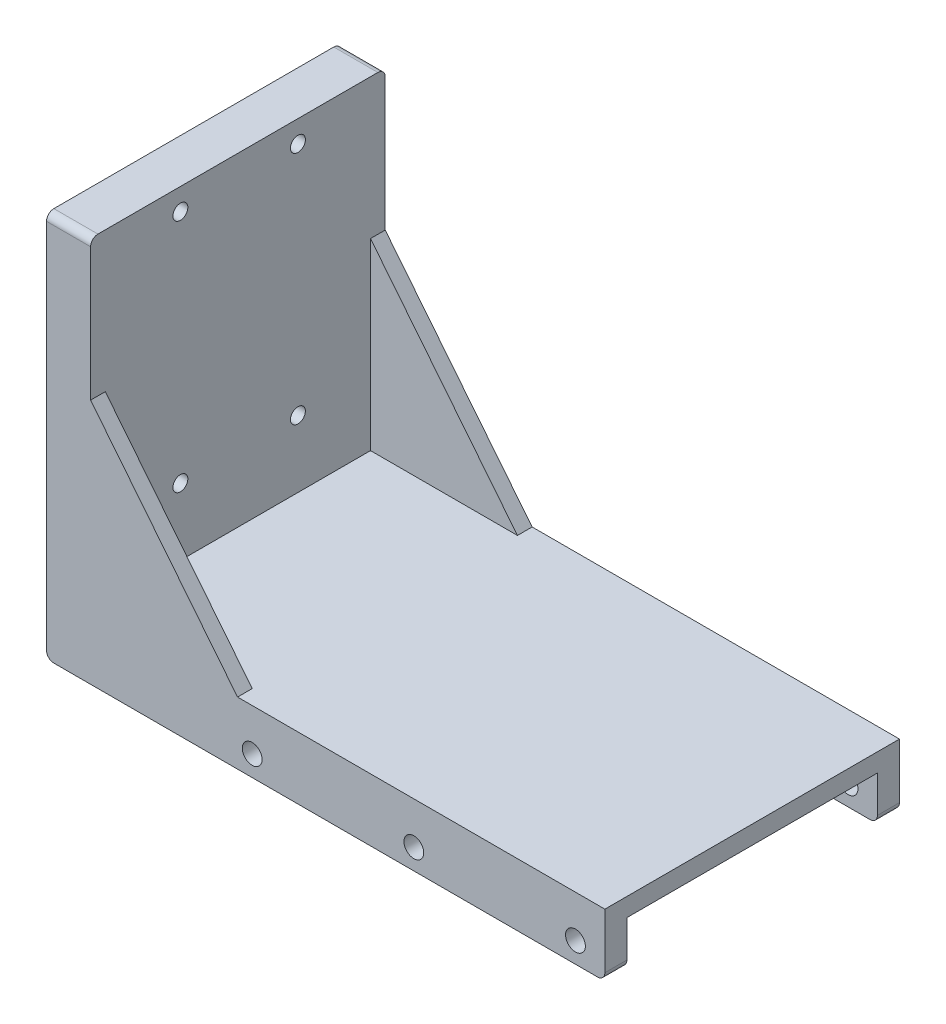
ISO-10303-21;
HEADER;
FILE_DESCRIPTION(('STEP AP214'),'2;1');
FILE_NAME('part.step','',(''),(''),'','','');
FILE_SCHEMA(('AUTOMOTIVE_DESIGN { 1 0 10303 214 1 1 1 1 }'));
ENDSEC;
DATA;
#1=APPLICATION_CONTEXT('core data for automotive mechanical design processes');
#2=APPLICATION_PROTOCOL_DEFINITION('international standard','automotive_design',2000,#1);
#3=PRODUCT_CONTEXT('',#1,'mechanical');
#4=PRODUCT('Part','Part','',(#3));
#5=PRODUCT_RELATED_PRODUCT_CATEGORY('part','',(#4));
#6=PRODUCT_DEFINITION_FORMATION('','',#4);
#7=PRODUCT_DEFINITION_CONTEXT('part definition',#1,'design');
#8=PRODUCT_DEFINITION('design','',#6,#7);
#9=PRODUCT_DEFINITION_SHAPE('','',#8);
#10=(LENGTH_UNIT() NAMED_UNIT(*) SI_UNIT(.MILLI.,.METRE.));
#11=(NAMED_UNIT(*) PLANE_ANGLE_UNIT() SI_UNIT($,.RADIAN.));
#12=(NAMED_UNIT(*) SI_UNIT($,.STERADIAN.) SOLID_ANGLE_UNIT());
#13=UNCERTAINTY_MEASURE_WITH_UNIT(LENGTH_MEASURE(1.E-05),#10,'distance_accuracy_value','');
#14=(GEOMETRIC_REPRESENTATION_CONTEXT(3) GLOBAL_UNCERTAINTY_ASSIGNED_CONTEXT((#13)) GLOBAL_UNIT_ASSIGNED_CONTEXT((#10,
#11,#12)) REPRESENTATION_CONTEXT('',''));
#15=CARTESIAN_POINT('',(0.,0.,0.));
#16=DIRECTION('',(0.,0.,1.));
#17=DIRECTION('',(1.,0.,0.));
#18=AXIS2_PLACEMENT_3D('',#15,#16,#17);
#19=CARTESIAN_POINT('',(6.00000000000001,8.5,40.1));
#20=DIRECTION('',(0.,-1.,0.));
#21=DIRECTION('',(0.,0.,-1.));
#22=AXIS2_PLACEMENT_3D('',#19,#20,#21);
#23=PLANE('',#22);
#24=DIRECTION('',(0.,0.,-1.));
#25=VECTOR('',#24,1.);
#26=CARTESIAN_POINT('',(26.,8.5,2.));
#27=LINE('',#26,#25);
#28=CARTESIAN_POINT('',(26.,8.5,2.));
#29=VERTEX_POINT('',#28);
#30=CARTESIAN_POINT('',(26.,8.5,0.));
#31=VERTEX_POINT('',#30);
#32=EDGE_CURVE('E376',#29,#31,#27,.T.);
#33=ORIENTED_EDGE('',*,*,#32,.F.);
#34=DIRECTION('',(1.,0.,0.));
#35=VECTOR('',#34,1.);
#36=CARTESIAN_POINT('',(6.00000000000001,8.5,2.));
#37=LINE('',#36,#35);
#38=CARTESIAN_POINT('',(6.00000000000001,8.5,2.));
#39=VERTEX_POINT('',#38);
#40=EDGE_CURVE('E187',#39,#29,#37,.T.);
#41=ORIENTED_EDGE('',*,*,#40,.F.);
#42=DIRECTION('',(0.,0.,-1.));
#43=VECTOR('',#42,1.);
#44=CARTESIAN_POINT('',(6.00000000000001,8.5,40.1));
#45=LINE('',#44,#43);
#46=CARTESIAN_POINT('',(6.00000000000001,8.5,38.1));
#47=VERTEX_POINT('',#46);
#48=EDGE_CURVE('E180',#47,#39,#45,.T.);
#49=ORIENTED_EDGE('',*,*,#48,.F.);
#50=DIRECTION('',(1.,0.,0.));
#51=VECTOR('',#50,1.);
#52=CARTESIAN_POINT('',(6.00000000000001,8.5,38.1));
#53=LINE('',#52,#51);
#54=CARTESIAN_POINT('',(26.,8.5,38.1));
#55=VERTEX_POINT('',#54);
#56=EDGE_CURVE('E165',#47,#55,#53,.T.);
#57=ORIENTED_EDGE('',*,*,#56,.T.);
#58=DIRECTION('',(0.,0.,1.));
#59=VECTOR('',#58,1.);
#60=CARTESIAN_POINT('',(26.,8.5,38.1));
#61=LINE('',#60,#59);
#62=CARTESIAN_POINT('',(26.,8.5,40.1));
#63=VERTEX_POINT('',#62);
#64=EDGE_CURVE('E371',#55,#63,#61,.T.);
#65=ORIENTED_EDGE('',*,*,#64,.T.);
#66=DIRECTION('',(-1.,0.,0.));
#67=VECTOR('',#66,1.);
#68=CARTESIAN_POINT('',(6.00000000000001,8.5,40.1));
#69=LINE('',#68,#67);
#70=CARTESIAN_POINT('',(76.,8.5,40.1));
#71=VERTEX_POINT('',#70);
#72=EDGE_CURVE('E301',#71,#63,#69,.T.);
#73=ORIENTED_EDGE('',*,*,#72,.F.);
#74=DIRECTION('',(0.,0.,-1.));
#75=VECTOR('',#74,1.);
#76=CARTESIAN_POINT('',(76.,8.5,40.1));
#77=LINE('',#76,#75);
#78=CARTESIAN_POINT('',(76.,8.5,0.));
#79=VERTEX_POINT('',#78);
#80=EDGE_CURVE('E188',#71,#79,#77,.T.);
#81=ORIENTED_EDGE('',*,*,#80,.T.);
#82=DIRECTION('',(-1.,0.,0.));
#83=VECTOR('',#82,1.);
#84=CARTESIAN_POINT('',(6.00000000000001,8.5,0.));
#85=LINE('',#84,#83);
#86=EDGE_CURVE('E279',#79,#31,#85,.T.);
#87=ORIENTED_EDGE('',*,*,#86,.T.);
#88=EDGE_LOOP('',(#33,#41,#49,#57,#65,#73,#81,#87));
#89=FACE_BOUND('',#88,.T.);
#90=ADVANCED_FACE('F34',(#89),#23,.F.);
#91=CARTESIAN_POINT('',(6.,52.578,40.1));
#92=DIRECTION('',(-1.,0.,0.));
#93=DIRECTION('',(0.,-1.,0.));
#94=AXIS2_PLACEMENT_3D('',#91,#92,#93);
#95=PLANE('',#94);
#96=CARTESIAN_POINT('',(6.00000000000001,17.6,27.88));
#97=DIRECTION('',(-1.,0.,0.));
#98=DIRECTION('',(0.,-1.,0.));
#99=AXIS2_PLACEMENT_3D('',#96,#97,#98);
#100=CIRCLE('',#99,1.016);
#101=CARTESIAN_POINT('',(6.00000000000001,16.584,27.88));
#102=VERTEX_POINT('',#101);
#103=EDGE_CURVE('E316',#102,#102,#100,.T.);
#104=ORIENTED_EDGE('',*,*,#103,.T.);
#105=EDGE_LOOP('',(#104));
#106=FACE_BOUND('',#105,.T.);
#107=CARTESIAN_POINT('',(6.00000000000001,17.6,11.88));
#108=DIRECTION('',(-1.,0.,0.));
#109=DIRECTION('',(0.,-1.,0.));
#110=AXIS2_PLACEMENT_3D('',#107,#108,#109);
#111=CIRCLE('',#110,1.016);
#112=CARTESIAN_POINT('',(6.00000000000001,16.584,11.88));
#113=VERTEX_POINT('',#112);
#114=EDGE_CURVE('E322',#113,#113,#111,.T.);
#115=ORIENTED_EDGE('',*,*,#114,.T.);
#116=EDGE_LOOP('',(#115));
#117=FACE_BOUND('',#116,.T.);
#118=CARTESIAN_POINT('',(6.,49.6,27.88));
#119=DIRECTION('',(-1.,0.,0.));
#120=DIRECTION('',(0.,-1.,0.));
#121=AXIS2_PLACEMENT_3D('',#118,#119,#120);
#122=CIRCLE('',#121,1.016);
#123=CARTESIAN_POINT('',(6.,48.584,27.88));
#124=VERTEX_POINT('',#123);
#125=EDGE_CURVE('E328',#124,#124,#122,.T.);
#126=ORIENTED_EDGE('',*,*,#125,.T.);
#127=EDGE_LOOP('',(#126));
#128=FACE_BOUND('',#127,.T.);
#129=CARTESIAN_POINT('',(6.,49.6,11.88));
#130=DIRECTION('',(-1.,0.,0.));
#131=DIRECTION('',(0.,-1.,0.));
#132=AXIS2_PLACEMENT_3D('',#129,#130,#131);
#133=CIRCLE('',#132,1.016);
#134=CARTESIAN_POINT('',(6.,48.584,11.88));
#135=VERTEX_POINT('',#134);
#136=EDGE_CURVE('E334',#135,#135,#133,.T.);
#137=ORIENTED_EDGE('',*,*,#136,.T.);
#138=EDGE_LOOP('',(#137));
#139=FACE_BOUND('',#138,.T.);
#140=DIRECTION('',(0.,0.,-1.));
#141=VECTOR('',#140,1.);
#142=CARTESIAN_POINT('',(6.,52.578,40.1));
#143=LINE('',#142,#141);
#144=CARTESIAN_POINT('',(6.,52.578,39.1));
#145=VERTEX_POINT('',#144);
#146=CARTESIAN_POINT('',(6.,52.578,1.));
#147=VERTEX_POINT('',#146);
#148=EDGE_CURVE('E189',#145,#147,#143,.T.);
#149=ORIENTED_EDGE('',*,*,#148,.F.);
#150=CARTESIAN_POINT('',(6.,51.578,39.1));
#151=DIRECTION('',(-1.,0.,0.));
#152=DIRECTION('',(0.,-1.,0.));
#153=AXIS2_PLACEMENT_3D('',#150,#151,#152);
#154=CIRCLE('',#153,1.);
#155=CARTESIAN_POINT('',(6.,51.578,40.1));
#156=VERTEX_POINT('',#155);
#157=EDGE_CURVE('E244',#145,#156,#154,.F.);
#158=ORIENTED_EDGE('',*,*,#157,.T.);
#159=DIRECTION('',(0.,1.,0.));
#160=VECTOR('',#159,1.);
#161=CARTESIAN_POINT('',(6.,52.578,40.1));
#162=LINE('',#161,#160);
#163=CARTESIAN_POINT('',(6.00000000000001,33.5,40.1));
#164=VERTEX_POINT('',#163);
#165=EDGE_CURVE('E296',#164,#156,#162,.T.);
#166=ORIENTED_EDGE('',*,*,#165,.F.);
#167=DIRECTION('',(0.,0.,1.));
#168=VECTOR('',#167,1.);
#169=CARTESIAN_POINT('',(6.00000000000001,33.5,38.1));
#170=LINE('',#169,#168);
#171=CARTESIAN_POINT('',(6.00000000000001,33.5,38.1));
#172=VERTEX_POINT('',#171);
#173=EDGE_CURVE('E183',#172,#164,#170,.T.);
#174=ORIENTED_EDGE('',*,*,#173,.F.);
#175=DIRECTION('',(0.,-1.,0.));
#176=VECTOR('',#175,1.);
#177=CARTESIAN_POINT('',(6.00000000000001,33.5,38.1));
#178=LINE('',#177,#176);
#179=EDGE_CURVE('E168',#172,#47,#178,.T.);
#180=ORIENTED_EDGE('',*,*,#179,.T.);
#181=ORIENTED_EDGE('',*,*,#48,.T.);
#182=DIRECTION('',(0.,-1.,0.));
#183=VECTOR('',#182,1.);
#184=CARTESIAN_POINT('',(6.00000000000001,33.5,2.));
#185=LINE('',#184,#183);
#186=CARTESIAN_POINT('',(6.,33.5,2.));
#187=VERTEX_POINT('',#186);
#188=EDGE_CURVE('E385',#187,#39,#185,.T.);
#189=ORIENTED_EDGE('',*,*,#188,.F.);
#190=DIRECTION('',(0.,0.,-1.));
#191=VECTOR('',#190,1.);
#192=CARTESIAN_POINT('',(6.00000000000001,33.5,2.));
#193=LINE('',#192,#191);
#194=CARTESIAN_POINT('',(6.,33.5,0.));
#195=VERTEX_POINT('',#194);
#196=EDGE_CURVE('E378',#187,#195,#193,.T.);
#197=ORIENTED_EDGE('',*,*,#196,.T.);
#198=DIRECTION('',(0.,1.,0.));
#199=VECTOR('',#198,1.);
#200=CARTESIAN_POINT('',(6.,52.578,0.));
#201=LINE('',#200,#199);
#202=CARTESIAN_POINT('',(6.,51.578,0.));
#203=VERTEX_POINT('',#202);
#204=EDGE_CURVE('E281',#195,#203,#201,.T.);
#205=ORIENTED_EDGE('',*,*,#204,.T.);
#206=CARTESIAN_POINT('',(6.,51.578,1.));
#207=DIRECTION('',(-1.,0.,0.));
#208=DIRECTION('',(0.,-1.,0.));
#209=AXIS2_PLACEMENT_3D('',#206,#207,#208);
#210=CIRCLE('',#209,1.);
#211=EDGE_CURVE('E242',#203,#147,#210,.F.);
#212=ORIENTED_EDGE('',*,*,#211,.T.);
#213=EDGE_LOOP('',(#149,#158,#166,#174,#180,#181,#189,#197,#205,#212));
#214=FACE_BOUND('',#213,.T.);
#215=ADVANCED_FACE('F179',(#106,#117,#128,#139,#214),#95,.F.);
#216=CARTESIAN_POINT('',(27.996,2.8,-10.7));
#217=DIRECTION('',(0.,0.,1.));
#218=DIRECTION('',(1.,0.,0.));
#219=AXIS2_PLACEMENT_3D('',#216,#217,#218);
#220=CYLINDRICAL_SURFACE('',#219,1.35);
#221=CARTESIAN_POINT('',(27.996,2.8,37.1));
#222=DIRECTION('',(0.,0.,1.));
#223=DIRECTION('',(1.,0.,0.));
#224=AXIS2_PLACEMENT_3D('',#221,#222,#223);
#225=CIRCLE('',#224,1.35);
#226=CARTESIAN_POINT('',(29.346,2.8,37.1));
#227=VERTEX_POINT('',#226);
#228=EDGE_CURVE('E342',#227,#227,#225,.F.);
#229=ORIENTED_EDGE('',*,*,#228,.T.);
#230=EDGE_LOOP('',(#229));
#231=FACE_BOUND('',#230,.T.);
#232=CARTESIAN_POINT('',(27.996,2.8,40.1));
#233=DIRECTION('',(0.,0.,1.));
#234=DIRECTION('',(1.,0.,0.));
#235=AXIS2_PLACEMENT_3D('',#232,#233,#234);
#236=CIRCLE('',#235,1.35);
#237=CARTESIAN_POINT('',(29.346,2.8,40.1));
#238=VERTEX_POINT('',#237);
#239=EDGE_CURVE('E203',#238,#238,#236,.T.);
#240=ORIENTED_EDGE('',*,*,#239,.T.);
#241=EDGE_LOOP('',(#240));
#242=FACE_BOUND('',#241,.T.);
#243=ADVANCED_FACE('F443',(#231,#242),#220,.F.);
#244=CARTESIAN_POINT('',(49.996,2.8,-10.7));
#245=DIRECTION('',(0.,0.,1.));
#246=DIRECTION('',(1.,0.,0.));
#247=AXIS2_PLACEMENT_3D('',#244,#245,#246);
#248=CYLINDRICAL_SURFACE('',#247,1.35);
#249=CARTESIAN_POINT('',(49.996,2.8,37.1));
#250=DIRECTION('',(0.,0.,1.));
#251=DIRECTION('',(1.,0.,0.));
#252=AXIS2_PLACEMENT_3D('',#249,#250,#251);
#253=CIRCLE('',#252,1.35);
#254=CARTESIAN_POINT('',(51.346,2.8,37.1));
#255=VERTEX_POINT('',#254);
#256=EDGE_CURVE('E220',#255,#255,#253,.F.);
#257=ORIENTED_EDGE('',*,*,#256,.T.);
#258=EDGE_LOOP('',(#257));
#259=FACE_BOUND('',#258,.T.);
#260=CARTESIAN_POINT('',(49.996,2.8,40.1));
#261=DIRECTION('',(0.,0.,1.));
#262=DIRECTION('',(1.,0.,0.));
#263=AXIS2_PLACEMENT_3D('',#260,#261,#262);
#264=CIRCLE('',#263,1.35);
#265=CARTESIAN_POINT('',(51.346,2.8,40.1));
#266=VERTEX_POINT('',#265);
#267=EDGE_CURVE('E207',#266,#266,#264,.T.);
#268=ORIENTED_EDGE('',*,*,#267,.T.);
#269=EDGE_LOOP('',(#268));
#270=FACE_BOUND('',#269,.T.);
#271=ADVANCED_FACE('F509',(#259,#270),#248,.F.);
#272=CARTESIAN_POINT('',(71.996,2.8,-10.7));
#273=DIRECTION('',(0.,0.,1.));
#274=DIRECTION('',(1.,0.,0.));
#275=AXIS2_PLACEMENT_3D('',#272,#273,#274);
#276=CYLINDRICAL_SURFACE('',#275,1.35000000000001);
#277=CARTESIAN_POINT('',(71.996,2.8,37.1));
#278=DIRECTION('',(0.,0.,1.));
#279=DIRECTION('',(1.,0.,0.));
#280=AXIS2_PLACEMENT_3D('',#277,#278,#279);
#281=CIRCLE('',#280,1.35000000000001);
#282=CARTESIAN_POINT('',(73.346,2.8,37.1));
#283=VERTEX_POINT('',#282);
#284=EDGE_CURVE('E217',#283,#283,#281,.F.);
#285=ORIENTED_EDGE('',*,*,#284,.T.);
#286=EDGE_LOOP('',(#285));
#287=FACE_BOUND('',#286,.T.);
#288=CARTESIAN_POINT('',(71.996,2.8,40.1));
#289=DIRECTION('',(0.,0.,1.));
#290=DIRECTION('',(1.,0.,0.));
#291=AXIS2_PLACEMENT_3D('',#288,#289,#290);
#292=CIRCLE('',#291,1.35000000000001);
#293=CARTESIAN_POINT('',(73.346,2.8,40.1));
#294=VERTEX_POINT('',#293);
#295=EDGE_CURVE('E211',#294,#294,#292,.T.);
#296=ORIENTED_EDGE('',*,*,#295,.T.);
#297=EDGE_LOOP('',(#296));
#298=FACE_BOUND('',#297,.T.);
#299=ADVANCED_FACE('F452',(#287,#298),#276,.F.);
#300=CARTESIAN_POINT('',(76.,0.,40.1));
#301=DIRECTION('',(0.,1.,0.));
#302=DIRECTION('',(-1.,0.,0.));
#303=AXIS2_PLACEMENT_3D('',#300,#301,#302);
#304=PLANE('',#303);
#305=DIRECTION('',(1.,0.,0.));
#306=VECTOR('',#305,1.);
#307=CARTESIAN_POINT('',(76.,0.,40.1));
#308=LINE('',#307,#306);
#309=CARTESIAN_POINT('',(1.,0.,40.1));
#310=VERTEX_POINT('',#309);
#311=CARTESIAN_POINT('',(75.,0.,40.1));
#312=VERTEX_POINT('',#311);
#313=EDGE_CURVE('E290',#310,#312,#308,.T.);
#314=ORIENTED_EDGE('',*,*,#313,.F.);
#315=DIRECTION('',(0.,0.,-1.));
#316=VECTOR('',#315,1.);
#317=CARTESIAN_POINT('',(1.,0.,40.1));
#318=LINE('',#317,#316);
#319=CARTESIAN_POINT('',(1.,0.,0.));
#320=VERTEX_POINT('',#319);
#321=EDGE_CURVE('E256',#310,#320,#318,.T.);
#322=ORIENTED_EDGE('',*,*,#321,.T.);
#323=DIRECTION('',(1.,0.,0.));
#324=VECTOR('',#323,1.);
#325=CARTESIAN_POINT('',(76.,0.,0.));
#326=LINE('',#325,#324);
#327=CARTESIAN_POINT('',(75.,0.,0.));
#328=VERTEX_POINT('',#327);
#329=EDGE_CURVE('E202',#320,#328,#326,.T.);
#330=ORIENTED_EDGE('',*,*,#329,.T.);
#331=DIRECTION('',(0.,0.,-1.));
#332=VECTOR('',#331,1.);
#333=CARTESIAN_POINT('',(75.,0.,40.1));
#334=LINE('',#333,#332);
#335=CARTESIAN_POINT('',(75.,0.,3.));
#336=VERTEX_POINT('',#335);
#337=EDGE_CURVE('E254',#328,#336,#334,.F.);
#338=ORIENTED_EDGE('',*,*,#337,.T.);
#339=DIRECTION('',(1.,0.,0.));
#340=VECTOR('',#339,1.);
#341=CARTESIAN_POINT('',(19.,0.,3.));
#342=LINE('',#341,#340);
#343=CARTESIAN_POINT('',(19.,0.,3.));
#344=VERTEX_POINT('',#343);
#345=EDGE_CURVE('E361',#344,#336,#342,.T.);
#346=ORIENTED_EDGE('',*,*,#345,.F.);
#347=DIRECTION('',(0.,0.,-1.));
#348=VECTOR('',#347,1.);
#349=CARTESIAN_POINT('',(19.,0.,37.1));
#350=LINE('',#349,#348);
#351=CARTESIAN_POINT('',(19.,0.,37.1));
#352=VERTEX_POINT('',#351);
#353=EDGE_CURVE('E363',#352,#344,#350,.T.);
#354=ORIENTED_EDGE('',*,*,#353,.F.);
#355=DIRECTION('',(-1.,0.,0.));
#356=VECTOR('',#355,1.);
#357=CARTESIAN_POINT('',(19.,0.,37.1));
#358=LINE('',#357,#356);
#359=CARTESIAN_POINT('',(75.,0.,37.1));
#360=VERTEX_POINT('',#359);
#361=EDGE_CURVE('E358',#360,#352,#358,.T.);
#362=ORIENTED_EDGE('',*,*,#361,.F.);
#363=DIRECTION('',(0.,0.,-1.));
#364=VECTOR('',#363,1.);
#365=CARTESIAN_POINT('',(75.,0.,40.1));
#366=LINE('',#365,#364);
#367=EDGE_CURVE('E252',#360,#312,#366,.F.);
#368=ORIENTED_EDGE('',*,*,#367,.T.);
#369=EDGE_LOOP('',(#314,#322,#330,#338,#346,#354,#362,#368));
#370=FACE_BOUND('',#369,.T.);
#371=ADVANCED_FACE('F408',(#370),#304,.F.);
#372=CARTESIAN_POINT('',(76.,8.5,40.1));
#373=DIRECTION('',(-1.,0.,0.));
#374=DIRECTION('',(0.,0.,1.));
#375=AXIS2_PLACEMENT_3D('',#372,#373,#374);
#376=PLANE('',#375);
#377=DIRECTION('',(0.,-1.,0.));
#378=VECTOR('',#377,1.);
#379=CARTESIAN_POINT('',(76.,8.5,3.));
#380=LINE('',#379,#378);
#381=CARTESIAN_POINT('',(76.,6.,3.));
#382=VERTEX_POINT('',#381);
#383=CARTESIAN_POINT('',(76.,1.,3.));
#384=VERTEX_POINT('',#383);
#385=EDGE_CURVE('E221',#382,#384,#380,.T.);
#386=ORIENTED_EDGE('',*,*,#385,.T.);
#387=DIRECTION('',(0.,0.,-1.));
#388=VECTOR('',#387,1.);
#389=CARTESIAN_POINT('',(76.,1.,40.1));
#390=LINE('',#389,#388);
#391=CARTESIAN_POINT('',(76.,1.,0.));
#392=VERTEX_POINT('',#391);
#393=EDGE_CURVE('E261',#384,#392,#390,.T.);
#394=ORIENTED_EDGE('',*,*,#393,.T.);
#395=DIRECTION('',(0.,1.,0.));
#396=VECTOR('',#395,1.);
#397=CARTESIAN_POINT('',(76.,8.5,0.));
#398=LINE('',#397,#396);
#399=EDGE_CURVE('E268',#392,#79,#398,.T.);
#400=ORIENTED_EDGE('',*,*,#399,.T.);
#401=ORIENTED_EDGE('',*,*,#80,.F.);
#402=DIRECTION('',(0.,1.,0.));
#403=VECTOR('',#402,1.);
#404=CARTESIAN_POINT('',(76.,8.5,40.1));
#405=LINE('',#404,#403);
#406=CARTESIAN_POINT('',(76.,1.,40.1));
#407=VERTEX_POINT('',#406);
#408=EDGE_CURVE('E306',#407,#71,#405,.T.);
#409=ORIENTED_EDGE('',*,*,#408,.F.);
#410=DIRECTION('',(0.,0.,-1.));
#411=VECTOR('',#410,1.);
#412=CARTESIAN_POINT('',(76.,1.,40.1));
#413=LINE('',#412,#411);
#414=CARTESIAN_POINT('',(76.,1.,37.1));
#415=VERTEX_POINT('',#414);
#416=EDGE_CURVE('E259',#407,#415,#413,.T.);
#417=ORIENTED_EDGE('',*,*,#416,.T.);
#418=DIRECTION('',(0.,1.,0.));
#419=VECTOR('',#418,1.);
#420=CARTESIAN_POINT('',(76.,8.5,37.1));
#421=LINE('',#420,#419);
#422=CARTESIAN_POINT('',(76.,6.,37.1));
#423=VERTEX_POINT('',#422);
#424=EDGE_CURVE('E340',#415,#423,#421,.T.);
#425=ORIENTED_EDGE('',*,*,#424,.T.);
#426=DIRECTION('',(0.,0.,1.));
#427=VECTOR('',#426,1.);
#428=CARTESIAN_POINT('',(76.,6.,40.1));
#429=LINE('',#428,#427);
#430=EDGE_CURVE('E192',#382,#423,#429,.T.);
#431=ORIENTED_EDGE('',*,*,#430,.F.);
#432=EDGE_LOOP('',(#386,#394,#400,#401,#409,#417,#425,#431));
#433=FACE_BOUND('',#432,.T.);
#434=ADVANCED_FACE('F266',(#433),#376,.F.);
#435=CARTESIAN_POINT('',(0.,52.578,40.1));
#436=DIRECTION('',(0.,-1.,0.));
#437=DIRECTION('',(0.,0.,-1.));
#438=AXIS2_PLACEMENT_3D('',#435,#436,#437);
#439=PLANE('',#438);
#440=DIRECTION('',(0.,0.,-1.));
#441=VECTOR('',#440,1.);
#442=CARTESIAN_POINT('',(0.,52.578,40.1));
#443=LINE('',#442,#441);
#444=CARTESIAN_POINT('',(0.,52.578,39.1));
#445=VERTEX_POINT('',#444);
#446=CARTESIAN_POINT('',(0.,52.578,1.));
#447=VERTEX_POINT('',#446);
#448=EDGE_CURVE('E195',#445,#447,#443,.T.);
#449=ORIENTED_EDGE('',*,*,#448,.F.);
#450=DIRECTION('',(-1.,0.,0.));
#451=VECTOR('',#450,1.);
#452=CARTESIAN_POINT('',(0.,52.578,39.1));
#453=LINE('',#452,#451);
#454=EDGE_CURVE('E240',#445,#145,#453,.F.);
#455=ORIENTED_EDGE('',*,*,#454,.T.);
#456=ORIENTED_EDGE('',*,*,#148,.T.);
#457=DIRECTION('',(-1.,0.,0.));
#458=VECTOR('',#457,1.);
#459=CARTESIAN_POINT('',(0.,52.578,1.));
#460=LINE('',#459,#458);
#461=EDGE_CURVE('E237',#147,#447,#460,.T.);
#462=ORIENTED_EDGE('',*,*,#461,.T.);
#463=EDGE_LOOP('',(#449,#455,#456,#462));
#464=FACE_BOUND('',#463,.T.);
#465=ADVANCED_FACE('F418',(#464),#439,.F.);
#466=CARTESIAN_POINT('',(0.,0.,40.1));
#467=DIRECTION('',(1.,0.,0.));
#468=DIRECTION('',(0.,0.,-1.));
#469=AXIS2_PLACEMENT_3D('',#466,#467,#468);
#470=PLANE('',#469);
#471=CARTESIAN_POINT('',(0.,49.6,11.88));
#472=DIRECTION('',(-1.,0.,0.));
#473=DIRECTION('',(0.,0.,-1.));
#474=AXIS2_PLACEMENT_3D('',#471,#472,#473);
#475=CIRCLE('',#474,1.016);
#476=CARTESIAN_POINT('',(0.,49.6,10.864));
#477=VERTEX_POINT('',#476);
#478=EDGE_CURVE('E337',#477,#477,#475,.T.);
#479=ORIENTED_EDGE('',*,*,#478,.F.);
#480=EDGE_LOOP('',(#479));
#481=FACE_BOUND('',#480,.T.);
#482=CARTESIAN_POINT('',(0.,49.6,27.88));
#483=DIRECTION('',(-1.,0.,0.));
#484=DIRECTION('',(0.,0.,1.));
#485=AXIS2_PLACEMENT_3D('',#482,#483,#484);
#486=CIRCLE('',#485,1.016);
#487=CARTESIAN_POINT('',(0.,49.6,28.896));
#488=VERTEX_POINT('',#487);
#489=EDGE_CURVE('E331',#488,#488,#486,.T.);
#490=ORIENTED_EDGE('',*,*,#489,.F.);
#491=EDGE_LOOP('',(#490));
#492=FACE_BOUND('',#491,.T.);
#493=CARTESIAN_POINT('',(0.,17.6,11.88));
#494=DIRECTION('',(-1.,0.,0.));
#495=DIRECTION('',(0.,0.,-1.));
#496=AXIS2_PLACEMENT_3D('',#493,#494,#495);
#497=CIRCLE('',#496,1.016);
#498=CARTESIAN_POINT('',(0.,17.6,10.864));
#499=VERTEX_POINT('',#498);
#500=EDGE_CURVE('E325',#499,#499,#497,.T.);
#501=ORIENTED_EDGE('',*,*,#500,.F.);
#502=EDGE_LOOP('',(#501));
#503=FACE_BOUND('',#502,.T.);
#504=CARTESIAN_POINT('',(0.,17.6,27.88));
#505=DIRECTION('',(-1.,0.,0.));
#506=DIRECTION('',(0.,0.,1.));
#507=AXIS2_PLACEMENT_3D('',#504,#505,#506);
#508=CIRCLE('',#507,1.016);
#509=CARTESIAN_POINT('',(0.,17.6,28.896));
#510=VERTEX_POINT('',#509);
#511=EDGE_CURVE('E319',#510,#510,#508,.T.);
#512=ORIENTED_EDGE('',*,*,#511,.F.);
#513=EDGE_LOOP('',(#512));
#514=FACE_BOUND('',#513,.T.);
#515=DIRECTION('',(0.,-1.,0.));
#516=VECTOR('',#515,1.);
#517=CARTESIAN_POINT('',(0.,0.,40.1));
#518=LINE('',#517,#516);
#519=CARTESIAN_POINT('',(0.,51.578,40.1));
#520=VERTEX_POINT('',#519);
#521=CARTESIAN_POINT('',(0.,1.,40.1));
#522=VERTEX_POINT('',#521);
#523=EDGE_CURVE('E292',#520,#522,#518,.T.);
#524=ORIENTED_EDGE('',*,*,#523,.F.);
#525=CARTESIAN_POINT('',(0.,51.578,39.1));
#526=DIRECTION('',(1.,0.,0.));
#527=DIRECTION('',(0.,0.,-1.));
#528=AXIS2_PLACEMENT_3D('',#525,#526,#527);
#529=CIRCLE('',#528,1.);
#530=EDGE_CURVE('E235',#520,#445,#529,.F.);
#531=ORIENTED_EDGE('',*,*,#530,.T.);
#532=ORIENTED_EDGE('',*,*,#448,.T.);
#533=CARTESIAN_POINT('',(0.,51.578,1.));
#534=DIRECTION('',(1.,0.,0.));
#535=DIRECTION('',(0.,0.,-1.));
#536=AXIS2_PLACEMENT_3D('',#533,#534,#535);
#537=CIRCLE('',#536,1.);
#538=CARTESIAN_POINT('',(0.,51.578,0.));
#539=VERTEX_POINT('',#538);
#540=EDGE_CURVE('E233',#447,#539,#537,.F.);
#541=ORIENTED_EDGE('',*,*,#540,.T.);
#542=DIRECTION('',(0.,-1.,0.));
#543=VECTOR('',#542,1.);
#544=CARTESIAN_POINT('',(0.,0.,0.));
#545=LINE('',#544,#543);
#546=CARTESIAN_POINT('',(0.,1.,0.));
#547=VERTEX_POINT('',#546);
#548=EDGE_CURVE('E288',#539,#547,#545,.T.);
#549=ORIENTED_EDGE('',*,*,#548,.T.);
#550=DIRECTION('',(0.,0.,-1.));
#551=VECTOR('',#550,1.);
#552=CARTESIAN_POINT('',(0.,1.,40.1));
#553=LINE('',#552,#551);
#554=EDGE_CURVE('E231',#547,#522,#553,.F.);
#555=ORIENTED_EDGE('',*,*,#554,.T.);
#556=EDGE_LOOP('',(#524,#531,#532,#541,#549,#555));
#557=FACE_BOUND('',#556,.T.);
#558=ADVANCED_FACE('F413',(#481,#492,#503,#514,#557),#470,.F.);
#559=CARTESIAN_POINT('',(0.,0.,40.1));
#560=DIRECTION('',(0.,0.,-1.));
#561=DIRECTION('',(-1.,0.,0.));
#562=AXIS2_PLACEMENT_3D('',#559,#560,#561);
#563=PLANE('',#562);
#564=ORIENTED_EDGE('',*,*,#165,.T.);
#565=DIRECTION('',(-1.,0.,0.));
#566=VECTOR('',#565,1.);
#567=CARTESIAN_POINT('',(0.,51.578,40.1));
#568=LINE('',#567,#566);
#569=EDGE_CURVE('E228',#156,#520,#568,.T.);
#570=ORIENTED_EDGE('',*,*,#569,.T.);
#571=ORIENTED_EDGE('',*,*,#523,.T.);
#572=CARTESIAN_POINT('',(1.,1.,40.1));
#573=DIRECTION('',(0.,0.,-1.));
#574=DIRECTION('',(-1.,0.,0.));
#575=AXIS2_PLACEMENT_3D('',#572,#573,#574);
#576=CIRCLE('',#575,1.);
#577=EDGE_CURVE('E226',#522,#310,#576,.F.);
#578=ORIENTED_EDGE('',*,*,#577,.T.);
#579=ORIENTED_EDGE('',*,*,#313,.T.);
#580=CARTESIAN_POINT('',(75.,1.,40.1));
#581=DIRECTION('',(0.,0.,-1.));
#582=DIRECTION('',(-1.,0.,0.));
#583=AXIS2_PLACEMENT_3D('',#580,#581,#582);
#584=CIRCLE('',#583,1.);
#585=EDGE_CURVE('E224',#312,#407,#584,.F.);
#586=ORIENTED_EDGE('',*,*,#585,.T.);
#587=ORIENTED_EDGE('',*,*,#408,.T.);
#588=ORIENTED_EDGE('',*,*,#72,.T.);
#589=DIRECTION('',(-0.624695047554424,0.78086880944303,0.));
#590=VECTOR('',#589,1.);
#591=CARTESIAN_POINT('',(26.,8.5,40.1));
#592=LINE('',#591,#590);
#593=EDGE_CURVE('E184',#63,#164,#592,.T.);
#594=ORIENTED_EDGE('',*,*,#593,.T.);
#595=EDGE_LOOP('',(#564,#570,#571,#578,#579,#586,#587,#588,#594));
#596=FACE_BOUND('',#595,.T.);
#597=ORIENTED_EDGE('',*,*,#295,.F.);
#598=EDGE_LOOP('',(#597));
#599=FACE_BOUND('',#598,.T.);
#600=ORIENTED_EDGE('',*,*,#267,.F.);
#601=EDGE_LOOP('',(#600));
#602=FACE_BOUND('',#601,.T.);
#603=ORIENTED_EDGE('',*,*,#239,.F.);
#604=EDGE_LOOP('',(#603));
#605=FACE_BOUND('',#604,.T.);
#606=ADVANCED_FACE('F403',(#596,#599,#602,#605),#563,.F.);
#607=CARTESIAN_POINT('',(0.,0.,0.));
#608=DIRECTION('',(0.,0.,-1.));
#609=DIRECTION('',(-1.,0.,0.));
#610=AXIS2_PLACEMENT_3D('',#607,#608,#609);
#611=PLANE('',#610);
#612=ORIENTED_EDGE('',*,*,#548,.F.);
#613=DIRECTION('',(-1.,0.,0.));
#614=VECTOR('',#613,1.);
#615=CARTESIAN_POINT('',(6.,51.578,0.));
#616=LINE('',#615,#614);
#617=EDGE_CURVE('E250',#539,#203,#616,.F.);
#618=ORIENTED_EDGE('',*,*,#617,.T.);
#619=ORIENTED_EDGE('',*,*,#204,.F.);
#620=DIRECTION('',(-0.624695047554424,0.78086880944303,0.));
#621=VECTOR('',#620,1.);
#622=CARTESIAN_POINT('',(26.,8.5,0.));
#623=LINE('',#622,#621);
#624=EDGE_CURVE('E382',#31,#195,#623,.T.);
#625=ORIENTED_EDGE('',*,*,#624,.F.);
#626=ORIENTED_EDGE('',*,*,#86,.F.);
#627=ORIENTED_EDGE('',*,*,#399,.F.);
#628=CARTESIAN_POINT('',(75.,1.,0.));
#629=DIRECTION('',(0.,0.,-1.));
#630=DIRECTION('',(-1.,0.,0.));
#631=AXIS2_PLACEMENT_3D('',#628,#629,#630);
#632=CIRCLE('',#631,1.);
#633=EDGE_CURVE('E246',#392,#328,#632,.T.);
#634=ORIENTED_EDGE('',*,*,#633,.T.);
#635=ORIENTED_EDGE('',*,*,#329,.F.);
#636=CARTESIAN_POINT('',(1.,1.,0.));
#637=DIRECTION('',(0.,0.,-1.));
#638=DIRECTION('',(-1.,0.,0.));
#639=AXIS2_PLACEMENT_3D('',#636,#637,#638);
#640=CIRCLE('',#639,1.);
#641=EDGE_CURVE('E248',#320,#547,#640,.T.);
#642=ORIENTED_EDGE('',*,*,#641,.T.);
#643=EDGE_LOOP('',(#612,#618,#619,#625,#626,#627,#634,#635,#642));
#644=FACE_BOUND('',#643,.T.);
#645=CARTESIAN_POINT('',(71.996,2.8,0.));
#646=DIRECTION('',(0.,0.,-1.));
#647=DIRECTION('',(-1.,0.,0.));
#648=AXIS2_PLACEMENT_3D('',#645,#646,#647);
#649=CIRCLE('',#648,1.35000000000001);
#650=CARTESIAN_POINT('',(70.646,2.8,0.));
#651=VERTEX_POINT('',#650);
#652=EDGE_CURVE('E208',#651,#651,#649,.T.);
#653=ORIENTED_EDGE('',*,*,#652,.F.);
#654=EDGE_LOOP('',(#653));
#655=FACE_BOUND('',#654,.T.);
#656=CARTESIAN_POINT('',(49.996,2.8,0.));
#657=DIRECTION('',(0.,0.,-1.));
#658=DIRECTION('',(-1.,0.,0.));
#659=AXIS2_PLACEMENT_3D('',#656,#657,#658);
#660=CIRCLE('',#659,1.35);
#661=CARTESIAN_POINT('',(48.646,2.8,0.));
#662=VERTEX_POINT('',#661);
#663=EDGE_CURVE('E204',#662,#662,#660,.T.);
#664=ORIENTED_EDGE('',*,*,#663,.F.);
#665=EDGE_LOOP('',(#664));
#666=FACE_BOUND('',#665,.T.);
#667=CARTESIAN_POINT('',(27.996,2.8,0.));
#668=DIRECTION('',(0.,0.,-1.));
#669=DIRECTION('',(-1.,0.,0.));
#670=AXIS2_PLACEMENT_3D('',#667,#668,#669);
#671=CIRCLE('',#670,1.35);
#672=CARTESIAN_POINT('',(26.646,2.8,0.));
#673=VERTEX_POINT('',#672);
#674=EDGE_CURVE('E199',#673,#673,#671,.T.);
#675=ORIENTED_EDGE('',*,*,#674,.F.);
#676=EDGE_LOOP('',(#675));
#677=FACE_BOUND('',#676,.T.);
#678=ADVANCED_FACE('F274',(#644,#655,#666,#677),#611,.T.);
#679=CARTESIAN_POINT('',(27.996,2.8,3.));
#680=DIRECTION('',(0.,0.,-1.));
#681=DIRECTION('',(-1.,0.,0.));
#682=AXIS2_PLACEMENT_3D('',#679,#680,#681);
#683=CIRCLE('',#682,1.35);
#684=CARTESIAN_POINT('',(26.646,2.8,3.));
#685=VERTEX_POINT('',#684);
#686=EDGE_CURVE('E348',#685,#685,#683,.F.);
#687=ORIENTED_EDGE('',*,*,#686,.T.);
#688=EDGE_LOOP('',(#687));
#689=FACE_BOUND('',#688,.T.);
#690=ORIENTED_EDGE('',*,*,#674,.T.);
#691=EDGE_LOOP('',(#690));
#692=FACE_BOUND('',#691,.T.);
#693=ADVANCED_FACE('F507',(#689,#692),#220,.F.);
#694=CARTESIAN_POINT('',(49.996,2.8,3.));
#695=DIRECTION('',(0.,0.,-1.));
#696=DIRECTION('',(-1.,0.,0.));
#697=AXIS2_PLACEMENT_3D('',#694,#695,#696);
#698=CIRCLE('',#697,1.35);
#699=CARTESIAN_POINT('',(48.646,2.8,3.));
#700=VERTEX_POINT('',#699);
#701=EDGE_CURVE('E215',#700,#700,#698,.F.);
#702=ORIENTED_EDGE('',*,*,#701,.T.);
#703=EDGE_LOOP('',(#702));
#704=FACE_BOUND('',#703,.T.);
#705=ORIENTED_EDGE('',*,*,#663,.T.);
#706=EDGE_LOOP('',(#705));
#707=FACE_BOUND('',#706,.T.);
#708=ADVANCED_FACE('F503',(#704,#707),#248,.F.);
#709=CARTESIAN_POINT('',(71.996,2.8,3.));
#710=DIRECTION('',(0.,0.,-1.));
#711=DIRECTION('',(-1.,0.,0.));
#712=AXIS2_PLACEMENT_3D('',#709,#710,#711);
#713=CIRCLE('',#712,1.35000000000001);
#714=CARTESIAN_POINT('',(70.646,2.8,3.));
#715=VERTEX_POINT('',#714);
#716=EDGE_CURVE('E212',#715,#715,#713,.F.);
#717=ORIENTED_EDGE('',*,*,#716,.T.);
#718=EDGE_LOOP('',(#717));
#719=FACE_BOUND('',#718,.T.);
#720=ORIENTED_EDGE('',*,*,#652,.T.);
#721=EDGE_LOOP('',(#720));
#722=FACE_BOUND('',#721,.T.);
#723=ADVANCED_FACE('F499',(#719,#722),#276,.F.);
#724=CARTESIAN_POINT('',(50.8,17.6,27.88));
#725=DIRECTION('',(-1.,0.,0.));
#726=DIRECTION('',(0.,0.,1.));
#727=AXIS2_PLACEMENT_3D('',#724,#725,#726);
#728=CYLINDRICAL_SURFACE('',#727,1.016);
#729=ORIENTED_EDGE('',*,*,#511,.T.);
#730=EDGE_LOOP('',(#729));
#731=FACE_BOUND('',#730,.T.);
#732=ORIENTED_EDGE('',*,*,#103,.F.);
#733=EDGE_LOOP('',(#732));
#734=FACE_BOUND('',#733,.T.);
#735=ADVANCED_FACE('F495',(#731,#734),#728,.F.);
#736=CARTESIAN_POINT('',(50.8,17.6,11.88));
#737=DIRECTION('',(-1.,0.,0.));
#738=DIRECTION('',(0.,0.,1.));
#739=AXIS2_PLACEMENT_3D('',#736,#737,#738);
#740=CYLINDRICAL_SURFACE('',#739,1.016);
#741=ORIENTED_EDGE('',*,*,#500,.T.);
#742=EDGE_LOOP('',(#741));
#743=FACE_BOUND('',#742,.T.);
#744=ORIENTED_EDGE('',*,*,#114,.F.);
#745=EDGE_LOOP('',(#744));
#746=FACE_BOUND('',#745,.T.);
#747=ADVANCED_FACE('F491',(#743,#746),#740,.F.);
#748=CARTESIAN_POINT('',(50.8,49.6,27.88));
#749=DIRECTION('',(-1.,0.,0.));
#750=DIRECTION('',(0.,0.,1.));
#751=AXIS2_PLACEMENT_3D('',#748,#749,#750);
#752=CYLINDRICAL_SURFACE('',#751,1.016);
#753=ORIENTED_EDGE('',*,*,#489,.T.);
#754=EDGE_LOOP('',(#753));
#755=FACE_BOUND('',#754,.T.);
#756=ORIENTED_EDGE('',*,*,#125,.F.);
#757=EDGE_LOOP('',(#756));
#758=FACE_BOUND('',#757,.T.);
#759=ADVANCED_FACE('F482',(#755,#758),#752,.F.);
#760=CARTESIAN_POINT('',(50.8,49.6,11.88));
#761=DIRECTION('',(-1.,0.,0.));
#762=DIRECTION('',(0.,0.,1.));
#763=AXIS2_PLACEMENT_3D('',#760,#761,#762);
#764=CYLINDRICAL_SURFACE('',#763,1.016);
#765=ORIENTED_EDGE('',*,*,#478,.T.);
#766=EDGE_LOOP('',(#765));
#767=FACE_BOUND('',#766,.T.);
#768=ORIENTED_EDGE('',*,*,#136,.F.);
#769=EDGE_LOOP('',(#768));
#770=FACE_BOUND('',#769,.T.);
#771=ADVANCED_FACE('F475',(#767,#770),#764,.F.);
#772=CARTESIAN_POINT('',(0.,6.,0.));
#773=DIRECTION('',(0.,-1.,0.));
#774=DIRECTION('',(1.,0.,0.));
#775=AXIS2_PLACEMENT_3D('',#772,#773,#774);
#776=PLANE('',#775);
#777=ORIENTED_EDGE('',*,*,#430,.T.);
#778=DIRECTION('',(-1.,0.,0.));
#779=VECTOR('',#778,1.);
#780=CARTESIAN_POINT('',(19.,6.,37.1));
#781=LINE('',#780,#779);
#782=CARTESIAN_POINT('',(19.,6.,37.1));
#783=VERTEX_POINT('',#782);
#784=EDGE_CURVE('E355',#423,#783,#781,.T.);
#785=ORIENTED_EDGE('',*,*,#784,.T.);
#786=DIRECTION('',(0.,0.,-1.));
#787=VECTOR('',#786,1.);
#788=CARTESIAN_POINT('',(19.,6.,37.1));
#789=LINE('',#788,#787);
#790=CARTESIAN_POINT('',(19.,6.,3.));
#791=VERTEX_POINT('',#790);
#792=EDGE_CURVE('E360',#783,#791,#789,.T.);
#793=ORIENTED_EDGE('',*,*,#792,.T.);
#794=DIRECTION('',(1.,0.,0.));
#795=VECTOR('',#794,1.);
#796=CARTESIAN_POINT('',(19.,6.,3.));
#797=LINE('',#796,#795);
#798=EDGE_CURVE('E367',#791,#382,#797,.T.);
#799=ORIENTED_EDGE('',*,*,#798,.T.);
#800=EDGE_LOOP('',(#777,#785,#793,#799));
#801=FACE_BOUND('',#800,.T.);
#802=ADVANCED_FACE('F473',(#801),#776,.T.);
#803=CARTESIAN_POINT('',(19.,6.,37.1));
#804=DIRECTION('',(0.,0.,1.));
#805=DIRECTION('',(1.,0.,0.));
#806=AXIS2_PLACEMENT_3D('',#803,#804,#805);
#807=PLANE('',#806);
#808=ORIENTED_EDGE('',*,*,#228,.F.);
#809=EDGE_LOOP('',(#808));
#810=FACE_BOUND('',#809,.T.);
#811=ORIENTED_EDGE('',*,*,#284,.F.);
#812=EDGE_LOOP('',(#811));
#813=FACE_BOUND('',#812,.T.);
#814=ORIENTED_EDGE('',*,*,#256,.F.);
#815=EDGE_LOOP('',(#814));
#816=FACE_BOUND('',#815,.T.);
#817=ORIENTED_EDGE('',*,*,#424,.F.);
#818=CARTESIAN_POINT('',(75.,1.,37.1));
#819=DIRECTION('',(0.,0.,1.));
#820=DIRECTION('',(1.,0.,0.));
#821=AXIS2_PLACEMENT_3D('',#818,#819,#820);
#822=CIRCLE('',#821,1.);
#823=EDGE_CURVE('E11',#415,#360,#822,.F.);
#824=ORIENTED_EDGE('',*,*,#823,.T.);
#825=ORIENTED_EDGE('',*,*,#361,.T.);
#826=DIRECTION('',(0.,-1.,0.));
#827=VECTOR('',#826,1.);
#828=CARTESIAN_POINT('',(19.,6.,37.1));
#829=LINE('',#828,#827);
#830=EDGE_CURVE('E216',#783,#352,#829,.T.);
#831=ORIENTED_EDGE('',*,*,#830,.F.);
#832=ORIENTED_EDGE('',*,*,#784,.F.);
#833=EDGE_LOOP('',(#817,#824,#825,#831,#832));
#834=FACE_BOUND('',#833,.T.);
#835=ADVANCED_FACE('F470',(#810,#813,#816,#834),#807,.F.);
#836=CARTESIAN_POINT('',(19.,6.,3.));
#837=DIRECTION('',(0.,0.,-1.));
#838=DIRECTION('',(-1.,0.,0.));
#839=AXIS2_PLACEMENT_3D('',#836,#837,#838);
#840=PLANE('',#839);
#841=ORIENTED_EDGE('',*,*,#686,.F.);
#842=EDGE_LOOP('',(#841));
#843=FACE_BOUND('',#842,.T.);
#844=ORIENTED_EDGE('',*,*,#716,.F.);
#845=EDGE_LOOP('',(#844));
#846=FACE_BOUND('',#845,.T.);
#847=ORIENTED_EDGE('',*,*,#701,.F.);
#848=EDGE_LOOP('',(#847));
#849=FACE_BOUND('',#848,.T.);
#850=ORIENTED_EDGE('',*,*,#345,.T.);
#851=CARTESIAN_POINT('',(75.,1.,3.));
#852=DIRECTION('',(0.,0.,-1.));
#853=DIRECTION('',(-1.,0.,0.));
#854=AXIS2_PLACEMENT_3D('',#851,#852,#853);
#855=CIRCLE('',#854,1.);
#856=EDGE_CURVE('E42',#336,#384,#855,.F.);
#857=ORIENTED_EDGE('',*,*,#856,.T.);
#858=ORIENTED_EDGE('',*,*,#385,.F.);
#859=ORIENTED_EDGE('',*,*,#798,.F.);
#860=DIRECTION('',(0.,-1.,0.));
#861=VECTOR('',#860,1.);
#862=CARTESIAN_POINT('',(19.,6.,3.));
#863=LINE('',#862,#861);
#864=EDGE_CURVE('E353',#791,#344,#863,.T.);
#865=ORIENTED_EDGE('',*,*,#864,.T.);
#866=EDGE_LOOP('',(#850,#857,#858,#859,#865));
#867=FACE_BOUND('',#866,.T.);
#868=ADVANCED_FACE('F434',(#843,#846,#849,#867),#840,.F.);
#869=CARTESIAN_POINT('',(19.,6.,37.1));
#870=DIRECTION('',(-1.,0.,0.));
#871=DIRECTION('',(0.,0.,1.));
#872=AXIS2_PLACEMENT_3D('',#869,#870,#871);
#873=PLANE('',#872);
#874=ORIENTED_EDGE('',*,*,#353,.T.);
#875=ORIENTED_EDGE('',*,*,#864,.F.);
#876=ORIENTED_EDGE('',*,*,#792,.F.);
#877=ORIENTED_EDGE('',*,*,#830,.T.);
#878=EDGE_LOOP('',(#874,#875,#876,#877));
#879=FACE_BOUND('',#878,.T.);
#880=ADVANCED_FACE('F427',(#879),#873,.F.);
#881=CARTESIAN_POINT('',(26.,8.5,38.1));
#882=DIRECTION('',(0.78086880944303,0.624695047554424,0.));
#883=DIRECTION('',(-0.624695047554424,0.78086880944303,0.));
#884=AXIS2_PLACEMENT_3D('',#881,#882,#883);
#885=PLANE('',#884);
#886=ORIENTED_EDGE('',*,*,#593,.F.);
#887=ORIENTED_EDGE('',*,*,#64,.F.);
#888=DIRECTION('',(-0.624695047554424,0.78086880944303,0.));
#889=VECTOR('',#888,1.);
#890=CARTESIAN_POINT('',(26.,8.5,38.1));
#891=LINE('',#890,#889);
#892=EDGE_CURVE('E170',#55,#172,#891,.T.);
#893=ORIENTED_EDGE('',*,*,#892,.T.);
#894=ORIENTED_EDGE('',*,*,#173,.T.);
#895=EDGE_LOOP('',(#886,#887,#893,#894));
#896=FACE_BOUND('',#895,.T.);
#897=ADVANCED_FACE('F425',(#896),#885,.T.);
#898=CARTESIAN_POINT('',(0.,0.,38.1));
#899=DIRECTION('',(0.,0.,1.));
#900=DIRECTION('',(1.,0.,0.));
#901=AXIS2_PLACEMENT_3D('',#898,#899,#900);
#902=PLANE('',#901);
#903=ORIENTED_EDGE('',*,*,#179,.F.);
#904=ORIENTED_EDGE('',*,*,#892,.F.);
#905=ORIENTED_EDGE('',*,*,#56,.F.);
#906=EDGE_LOOP('',(#903,#904,#905));
#907=FACE_BOUND('',#906,.T.);
#908=ADVANCED_FACE('F167',(#907),#902,.F.);
#909=CARTESIAN_POINT('',(26.,8.5,2.));
#910=DIRECTION('',(-0.78086880944303,-0.624695047554424,0.));
#911=DIRECTION('',(0.624695047554424,-0.78086880944303,0.));
#912=AXIS2_PLACEMENT_3D('',#909,#910,#911);
#913=PLANE('',#912);
#914=ORIENTED_EDGE('',*,*,#624,.T.);
#915=ORIENTED_EDGE('',*,*,#196,.F.);
#916=DIRECTION('',(-0.624695047554424,0.78086880944303,0.));
#917=VECTOR('',#916,1.);
#918=CARTESIAN_POINT('',(26.,8.5,2.));
#919=LINE('',#918,#917);
#920=EDGE_CURVE('E387',#29,#187,#919,.T.);
#921=ORIENTED_EDGE('',*,*,#920,.F.);
#922=ORIENTED_EDGE('',*,*,#32,.T.);
#923=EDGE_LOOP('',(#914,#915,#921,#922));
#924=FACE_BOUND('',#923,.T.);
#925=ADVANCED_FACE('F398',(#924),#913,.F.);
#926=CARTESIAN_POINT('',(0.,0.,2.));
#927=DIRECTION('',(0.,0.,-1.));
#928=DIRECTION('',(1.,0.,0.));
#929=AXIS2_PLACEMENT_3D('',#926,#927,#928);
#930=PLANE('',#929);
#931=ORIENTED_EDGE('',*,*,#188,.T.);
#932=ORIENTED_EDGE('',*,*,#40,.T.);
#933=ORIENTED_EDGE('',*,*,#920,.T.);
#934=EDGE_LOOP('',(#931,#932,#933));
#935=FACE_BOUND('',#934,.T.);
#936=ADVANCED_FACE('F391',(#935),#930,.F.);
#937=CARTESIAN_POINT('',(0.,51.578,39.1));
#938=DIRECTION('',(-1.,0.,0.));
#939=DIRECTION('',(0.,0.,1.));
#940=AXIS2_PLACEMENT_3D('',#937,#938,#939);
#941=CYLINDRICAL_SURFACE('',#940,1.);
#942=ORIENTED_EDGE('',*,*,#157,.F.);
#943=ORIENTED_EDGE('',*,*,#454,.F.);
#944=ORIENTED_EDGE('',*,*,#530,.F.);
#945=ORIENTED_EDGE('',*,*,#569,.F.);
#946=EDGE_LOOP('',(#942,#943,#944,#945));
#947=FACE_BOUND('',#946,.T.);
#948=ADVANCED_FACE('F423',(#947),#941,.T.);
#949=CARTESIAN_POINT('',(0.,51.578,1.));
#950=DIRECTION('',(1.,0.,0.));
#951=DIRECTION('',(0.,0.,-1.));
#952=AXIS2_PLACEMENT_3D('',#949,#950,#951);
#953=CYLINDRICAL_SURFACE('',#952,1.);
#954=ORIENTED_EDGE('',*,*,#211,.F.);
#955=ORIENTED_EDGE('',*,*,#617,.F.);
#956=ORIENTED_EDGE('',*,*,#540,.F.);
#957=ORIENTED_EDGE('',*,*,#461,.F.);
#958=EDGE_LOOP('',(#954,#955,#956,#957));
#959=FACE_BOUND('',#958,.T.);
#960=ADVANCED_FACE('F416',(#959),#953,.T.);
#961=CARTESIAN_POINT('',(1.,1.,40.1));
#962=DIRECTION('',(0.,0.,-1.));
#963=DIRECTION('',(-1.,0.,0.));
#964=AXIS2_PLACEMENT_3D('',#961,#962,#963);
#965=CYLINDRICAL_SURFACE('',#964,1.);
#966=ORIENTED_EDGE('',*,*,#577,.F.);
#967=ORIENTED_EDGE('',*,*,#554,.F.);
#968=ORIENTED_EDGE('',*,*,#641,.F.);
#969=ORIENTED_EDGE('',*,*,#321,.F.);
#970=EDGE_LOOP('',(#966,#967,#968,#969));
#971=FACE_BOUND('',#970,.T.);
#972=ADVANCED_FACE('F411',(#971),#965,.T.);
#973=CARTESIAN_POINT('',(75.,1.,40.1));
#974=DIRECTION('',(0.,0.,-1.));
#975=DIRECTION('',(-1.,0.,0.));
#976=AXIS2_PLACEMENT_3D('',#973,#974,#975);
#977=CYLINDRICAL_SURFACE('',#976,1.);
#978=ORIENTED_EDGE('',*,*,#856,.F.);
#979=ORIENTED_EDGE('',*,*,#337,.F.);
#980=ORIENTED_EDGE('',*,*,#633,.F.);
#981=ORIENTED_EDGE('',*,*,#393,.F.);
#982=EDGE_LOOP('',(#978,#979,#980,#981));
#983=FACE_BOUND('',#982,.T.);
#984=ADVANCED_FACE('F458',(#983),#977,.T.);
#985=CARTESIAN_POINT('',(75.,1.,40.1));
#986=DIRECTION('',(0.,0.,-1.));
#987=DIRECTION('',(-1.,0.,0.));
#988=AXIS2_PLACEMENT_3D('',#985,#986,#987);
#989=CYLINDRICAL_SURFACE('',#988,1.);
#990=ORIENTED_EDGE('',*,*,#585,.F.);
#991=ORIENTED_EDGE('',*,*,#367,.F.);
#992=ORIENTED_EDGE('',*,*,#823,.F.);
#993=ORIENTED_EDGE('',*,*,#416,.F.);
#994=EDGE_LOOP('',(#990,#991,#992,#993));
#995=FACE_BOUND('',#994,.T.);
#996=ADVANCED_FACE('F36',(#995),#989,.T.);
#997=CLOSED_SHELL('',(#90,#215,#243,#271,#299,#371,#434,#465,#558,#606,#678,#693,#708,#723,#735,
#747,#759,#771,#802,#835,#868,#880,#897,#908,#925,#936,#948,#960,#972,#984,#996));
#998=MANIFOLD_SOLID_BREP('B2',#997);
#999=ADVANCED_BREP_SHAPE_REPRESENTATION('',(#18,#998),#14);
#1000=SHAPE_DEFINITION_REPRESENTATION(#9,#999);
ENDSEC;
END-ISO-10303-21;
